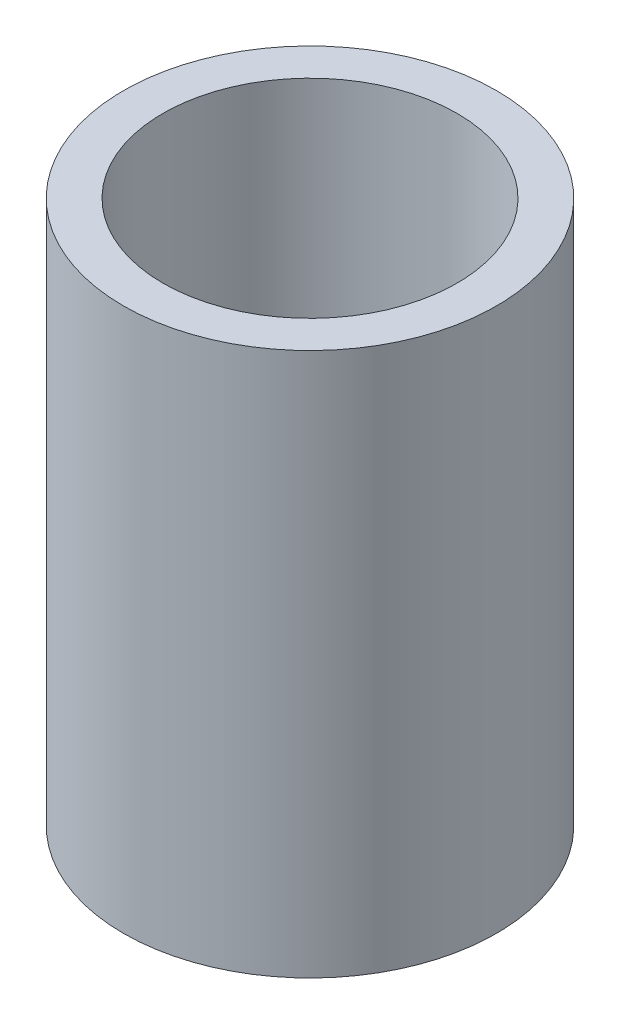
ISO-10303-21;
HEADER;
FILE_DESCRIPTION(('STEP AP214'),'2;1');
FILE_NAME('part.step','',(''),(''),'','','');
FILE_SCHEMA(('AUTOMOTIVE_DESIGN { 1 0 10303 214 1 1 1 1 }'));
ENDSEC;
DATA;
#1=APPLICATION_CONTEXT('core data for automotive mechanical design processes');
#2=APPLICATION_PROTOCOL_DEFINITION('international standard','automotive_design',2000,#1);
#3=PRODUCT_CONTEXT('',#1,'mechanical');
#4=PRODUCT('Part','Part','',(#3));
#5=PRODUCT_RELATED_PRODUCT_CATEGORY('part','',(#4));
#6=PRODUCT_DEFINITION_FORMATION('','',#4);
#7=PRODUCT_DEFINITION_CONTEXT('part definition',#1,'design');
#8=PRODUCT_DEFINITION('design','',#6,#7);
#9=PRODUCT_DEFINITION_SHAPE('','',#8);
#10=(LENGTH_UNIT() NAMED_UNIT(*) SI_UNIT(.MILLI.,.METRE.));
#11=(NAMED_UNIT(*) PLANE_ANGLE_UNIT() SI_UNIT($,.RADIAN.));
#12=(NAMED_UNIT(*) SI_UNIT($,.STERADIAN.) SOLID_ANGLE_UNIT());
#13=UNCERTAINTY_MEASURE_WITH_UNIT(LENGTH_MEASURE(1.E-05),#10,'distance_accuracy_value','');
#14=(GEOMETRIC_REPRESENTATION_CONTEXT(3) GLOBAL_UNCERTAINTY_ASSIGNED_CONTEXT((#13)) GLOBAL_UNIT_ASSIGNED_CONTEXT((#10,
#11,#12)) REPRESENTATION_CONTEXT('',''));
#15=CARTESIAN_POINT('',(0.,0.,0.));
#16=DIRECTION('',(0.,0.,1.));
#17=DIRECTION('',(1.,0.,0.));
#18=AXIS2_PLACEMENT_3D('',#15,#16,#17);
#19=CARTESIAN_POINT('',(0.,18.5,0.));
#20=DIRECTION('',(0.,1.,0.));
#21=DIRECTION('',(0.,0.,1.));
#22=AXIS2_PLACEMENT_3D('',#19,#20,#21);
#23=PLANE('',#22);
#24=CARTESIAN_POINT('',(0.,18.5,0.));
#25=DIRECTION('',(0.,1.,0.));
#26=DIRECTION('',(0.,0.,1.));
#27=AXIS2_PLACEMENT_3D('',#24,#25,#26);
#28=CIRCLE('',#27,6.35);
#29=CARTESIAN_POINT('',(0.,18.5,6.35));
#30=VERTEX_POINT('',#29);
#31=EDGE_CURVE('E10',#30,#30,#28,.T.);
#32=ORIENTED_EDGE('',*,*,#31,.T.);
#33=EDGE_LOOP('',(#32));
#34=FACE_BOUND('',#33,.T.);
#35=CARTESIAN_POINT('',(0.,18.5,0.));
#36=DIRECTION('',(0.,1.,0.));
#37=DIRECTION('',(0.,0.,1.));
#38=AXIS2_PLACEMENT_3D('',#35,#36,#37);
#39=CIRCLE('',#38,5.0075);
#40=CARTESIAN_POINT('',(0.,18.5,5.0075));
#41=VERTEX_POINT('',#40);
#42=EDGE_CURVE('E46',#41,#41,#39,.T.);
#43=ORIENTED_EDGE('',*,*,#42,.F.);
#44=EDGE_LOOP('',(#43));
#45=FACE_BOUND('',#44,.T.);
#46=ADVANCED_FACE('F35',(#34,#45),#23,.T.);
#47=CARTESIAN_POINT('',(0.,0.,0.));
#48=DIRECTION('',(0.,1.,0.));
#49=DIRECTION('',(0.,0.,1.));
#50=AXIS2_PLACEMENT_3D('',#47,#48,#49);
#51=PLANE('',#50);
#52=CARTESIAN_POINT('',(0.,0.,0.));
#53=DIRECTION('',(0.,1.,0.));
#54=DIRECTION('',(0.,0.,1.));
#55=AXIS2_PLACEMENT_3D('',#52,#53,#54);
#56=CIRCLE('',#55,6.35);
#57=CARTESIAN_POINT('',(0.,0.,6.35));
#58=VERTEX_POINT('',#57);
#59=EDGE_CURVE('E39',#58,#58,#56,.T.);
#60=ORIENTED_EDGE('',*,*,#59,.F.);
#61=EDGE_LOOP('',(#60));
#62=FACE_BOUND('',#61,.T.);
#63=CARTESIAN_POINT('',(0.,0.,0.));
#64=DIRECTION('',(0.,1.,0.));
#65=DIRECTION('',(0.,0.,1.));
#66=AXIS2_PLACEMENT_3D('',#63,#64,#65);
#67=CIRCLE('',#66,5.0075);
#68=CARTESIAN_POINT('',(0.,0.,5.0075));
#69=VERTEX_POINT('',#68);
#70=EDGE_CURVE('E48',#69,#69,#67,.T.);
#71=ORIENTED_EDGE('',*,*,#70,.T.);
#72=EDGE_LOOP('',(#71));
#73=FACE_BOUND('',#72,.T.);
#74=ADVANCED_FACE('F58',(#62,#73),#51,.F.);
#75=CARTESIAN_POINT('',(0.,18.5,0.));
#76=DIRECTION('',(0.,-1.,0.));
#77=DIRECTION('',(0.,0.,-1.));
#78=AXIS2_PLACEMENT_3D('',#75,#76,#77);
#79=CYLINDRICAL_SURFACE('',#78,6.35);
#80=ORIENTED_EDGE('',*,*,#31,.F.);
#81=EDGE_LOOP('',(#80));
#82=FACE_BOUND('',#81,.T.);
#83=ORIENTED_EDGE('',*,*,#59,.T.);
#84=EDGE_LOOP('',(#83));
#85=FACE_BOUND('',#84,.T.);
#86=ADVANCED_FACE('F37',(#82,#85),#79,.T.);
#87=CARTESIAN_POINT('',(0.,18.5,0.));
#88=DIRECTION('',(0.,-1.,0.));
#89=DIRECTION('',(0.,0.,-1.));
#90=AXIS2_PLACEMENT_3D('',#87,#88,#89);
#91=CYLINDRICAL_SURFACE('',#90,5.0075);
#92=ORIENTED_EDGE('',*,*,#42,.T.);
#93=EDGE_LOOP('',(#92));
#94=FACE_BOUND('',#93,.T.);
#95=ORIENTED_EDGE('',*,*,#70,.F.);
#96=EDGE_LOOP('',(#95));
#97=FACE_BOUND('',#96,.T.);
#98=ADVANCED_FACE('F54',(#94,#97),#91,.F.);
#99=CLOSED_SHELL('',(#46,#74,#86,#98));
#100=MANIFOLD_SOLID_BREP('B2',#99);
#101=ADVANCED_BREP_SHAPE_REPRESENTATION('',(#18,#100),#14);
#102=SHAPE_DEFINITION_REPRESENTATION(#9,#101);
ENDSEC;
END-ISO-10303-21;
